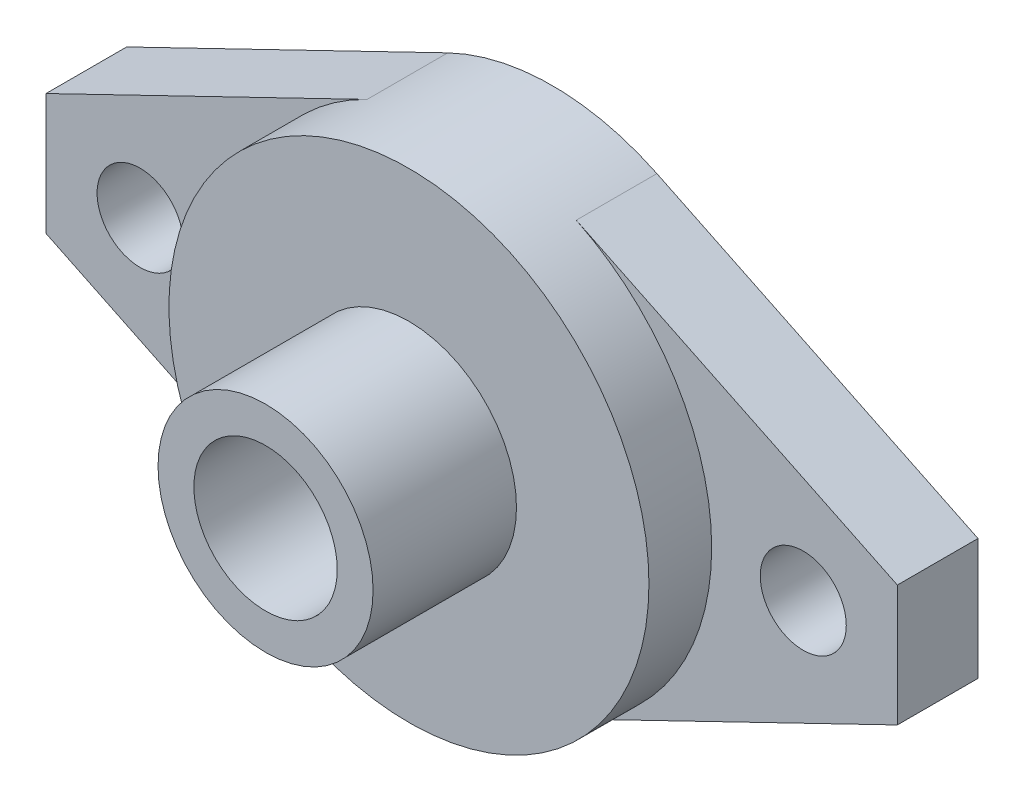
ISO-10303-21;
HEADER;
FILE_DESCRIPTION(('STEP AP214'),'2;1');
FILE_NAME('part.step','',(''),(''),'','','');
FILE_SCHEMA(('AUTOMOTIVE_DESIGN { 1 0 10303 214 1 1 1 1 }'));
ENDSEC;
DATA;
#1=APPLICATION_CONTEXT('core data for automotive mechanical design processes');
#2=APPLICATION_PROTOCOL_DEFINITION('international standard','automotive_design',2000,#1);
#3=PRODUCT_CONTEXT('',#1,'mechanical');
#4=PRODUCT('Part','Part','',(#3));
#5=PRODUCT_RELATED_PRODUCT_CATEGORY('part','',(#4));
#6=PRODUCT_DEFINITION_FORMATION('','',#4);
#7=PRODUCT_DEFINITION_CONTEXT('part definition',#1,'design');
#8=PRODUCT_DEFINITION('design','',#6,#7);
#9=PRODUCT_DEFINITION_SHAPE('','',#8);
#10=(LENGTH_UNIT() NAMED_UNIT(*) SI_UNIT(.MILLI.,.METRE.));
#11=(NAMED_UNIT(*) PLANE_ANGLE_UNIT() SI_UNIT($,.RADIAN.));
#12=(NAMED_UNIT(*) SI_UNIT($,.STERADIAN.) SOLID_ANGLE_UNIT());
#13=UNCERTAINTY_MEASURE_WITH_UNIT(LENGTH_MEASURE(1.E-05),#10,'distance_accuracy_value','');
#14=(GEOMETRIC_REPRESENTATION_CONTEXT(3) GLOBAL_UNCERTAINTY_ASSIGNED_CONTEXT((#13)) GLOBAL_UNIT_ASSIGNED_CONTEXT((#10,
#11,#12)) REPRESENTATION_CONTEXT('',''));
#15=CARTESIAN_POINT('',(0.,0.,0.));
#16=DIRECTION('',(0.,0.,1.));
#17=DIRECTION('',(1.,0.,0.));
#18=AXIS2_PLACEMENT_3D('',#15,#16,#17);
#19=CARTESIAN_POINT('',(0.,0.,16.));
#20=DIRECTION('',(0.,0.,-1.));
#21=DIRECTION('',(-1.,0.,0.));
#22=AXIS2_PLACEMENT_3D('',#19,#20,#21);
#23=CYLINDRICAL_SURFACE('',#22,4.);
#24=CARTESIAN_POINT('',(0.,0.,16.));
#25=DIRECTION('',(0.,0.,1.));
#26=DIRECTION('',(1.,0.,0.));
#27=AXIS2_PLACEMENT_3D('',#24,#25,#26);
#28=CIRCLE('',#27,4.);
#29=CARTESIAN_POINT('',(4.,0.,16.));
#30=VERTEX_POINT('',#29);
#31=EDGE_CURVE('E53',#30,#30,#28,.T.);
#32=ORIENTED_EDGE('',*,*,#31,.T.);
#33=EDGE_LOOP('',(#32));
#34=FACE_BOUND('',#33,.T.);
#35=CARTESIAN_POINT('',(0.,0.,0.));
#36=DIRECTION('',(0.,0.,1.));
#37=DIRECTION('',(1.,0.,0.));
#38=AXIS2_PLACEMENT_3D('',#35,#36,#37);
#39=CIRCLE('',#38,4.);
#40=CARTESIAN_POINT('',(4.,0.,0.));
#41=VERTEX_POINT('',#40);
#42=EDGE_CURVE('E59',#41,#41,#39,.T.);
#43=ORIENTED_EDGE('',*,*,#42,.F.);
#44=EDGE_LOOP('',(#43));
#45=FACE_BOUND('',#44,.T.);
#46=ADVANCED_FACE('F46',(#34,#45),#23,.F.);
#47=CARTESIAN_POINT('',(0.,0.,16.));
#48=DIRECTION('',(0.,0.,-1.));
#49=DIRECTION('',(-1.,0.,0.));
#50=AXIS2_PLACEMENT_3D('',#47,#48,#49);
#51=CYLINDRICAL_SURFACE('',#50,6.);
#52=CARTESIAN_POINT('',(0.,0.,16.));
#53=DIRECTION('',(0.,0.,1.));
#54=DIRECTION('',(1.,0.,0.));
#55=AXIS2_PLACEMENT_3D('',#52,#53,#54);
#56=CIRCLE('',#55,6.);
#57=CARTESIAN_POINT('',(6.,0.,16.));
#58=VERTEX_POINT('',#57);
#59=EDGE_CURVE('E11',#58,#58,#56,.T.);
#60=ORIENTED_EDGE('',*,*,#59,.F.);
#61=EDGE_LOOP('',(#60));
#62=FACE_BOUND('',#61,.T.);
#63=CARTESIAN_POINT('',(0.,0.,0.));
#64=DIRECTION('',(0.,0.,1.));
#65=DIRECTION('',(1.,0.,0.));
#66=AXIS2_PLACEMENT_3D('',#63,#64,#65);
#67=CIRCLE('',#66,6.);
#68=CARTESIAN_POINT('',(6.,0.,0.));
#69=VERTEX_POINT('',#68);
#70=EDGE_CURVE('E49',#69,#69,#67,.T.);
#71=ORIENTED_EDGE('',*,*,#70,.T.);
#72=EDGE_LOOP('',(#71));
#73=FACE_BOUND('',#72,.T.);
#74=ADVANCED_FACE('F66',(#62,#73),#51,.T.);
#75=CARTESIAN_POINT('',(0.,0.,16.));
#76=DIRECTION('',(0.,0.,1.));
#77=DIRECTION('',(1.,0.,0.));
#78=AXIS2_PLACEMENT_3D('',#75,#76,#77);
#79=PLANE('',#78);
#80=ORIENTED_EDGE('',*,*,#31,.F.);
#81=EDGE_LOOP('',(#80));
#82=FACE_BOUND('',#81,.T.);
#83=ORIENTED_EDGE('',*,*,#59,.T.);
#84=EDGE_LOOP('',(#83));
#85=FACE_BOUND('',#84,.T.);
#86=ADVANCED_FACE('F70',(#82,#85),#79,.T.);
#87=CARTESIAN_POINT('',(0.,0.,0.));
#88=DIRECTION('',(0.,0.,1.));
#89=DIRECTION('',(1.,0.,0.));
#90=AXIS2_PLACEMENT_3D('',#87,#88,#89);
#91=PLANE('',#90);
#92=ORIENTED_EDGE('',*,*,#42,.T.);
#93=EDGE_LOOP('',(#92));
#94=FACE_BOUND('',#93,.T.);
#95=ORIENTED_EDGE('',*,*,#70,.F.);
#96=EDGE_LOOP('',(#95));
#97=FACE_BOUND('',#96,.T.);
#98=ADVANCED_FACE('F68',(#94,#97),#91,.F.);
#99=CLOSED_SHELL('',(#46,#74,#86,#98));
#100=MANIFOLD_SOLID_BREP('B2',#99);
#101=CARTESIAN_POINT('',(0.,0.,8.));
#102=DIRECTION('',(0.,0.,-1.));
#103=DIRECTION('',(-1.,0.,0.));
#104=AXIS2_PLACEMENT_3D('',#101,#102,#103);
#105=CYLINDRICAL_SURFACE('',#104,13.3910717733651);
#106=CARTESIAN_POINT('',(0.,0.,8.));
#107=DIRECTION('',(0.,0.,1.));
#108=DIRECTION('',(1.,0.,0.));
#109=AXIS2_PLACEMENT_3D('',#106,#107,#108);
#110=CIRCLE('',#109,13.3910717733651);
#111=CARTESIAN_POINT('',(13.3910717733651,0.,8.));
#112=VERTEX_POINT('',#111);
#113=EDGE_CURVE('E212',#112,#112,#110,.T.);
#114=ORIENTED_EDGE('',*,*,#113,.F.);
#115=EDGE_LOOP('',(#114));
#116=FACE_BOUND('',#115,.T.);
#117=DIRECTION('',(0.,0.,-1.));
#118=VECTOR('',#117,1.);
#119=CARTESIAN_POINT('',(5.83466280405099,-12.0531121791196,4.5));
#120=LINE('',#119,#118);
#121=CARTESIAN_POINT('',(5.83466280405099,-12.0531121791196,4.5));
#122=VERTEX_POINT('',#121);
#123=CARTESIAN_POINT('',(5.83466280405099,-12.0531121791196,0.));
#124=VERTEX_POINT('',#123);
#125=EDGE_CURVE('E127',#122,#124,#120,.T.);
#126=ORIENTED_EDGE('',*,*,#125,.F.);
#127=CARTESIAN_POINT('',(0.,0.,4.5));
#128=DIRECTION('',(0.,0.,1.));
#129=DIRECTION('',(1.,0.,0.));
#130=AXIS2_PLACEMENT_3D('',#127,#128,#129);
#131=CIRCLE('',#130,13.3910717733651);
#132=CARTESIAN_POINT('',(5.83466280405099,12.0531121791196,4.5));
#133=VERTEX_POINT('',#132);
#134=EDGE_CURVE('E122',#122,#133,#131,.T.);
#135=ORIENTED_EDGE('',*,*,#134,.T.);
#136=DIRECTION('',(0.,0.,-1.));
#137=VECTOR('',#136,1.);
#138=CARTESIAN_POINT('',(5.83466280405099,12.0531121791196,4.5));
#139=LINE('',#138,#137);
#140=CARTESIAN_POINT('',(5.83466280405099,12.0531121791196,0.));
#141=VERTEX_POINT('',#140);
#142=EDGE_CURVE('E198',#133,#141,#139,.T.);
#143=ORIENTED_EDGE('',*,*,#142,.T.);
#144=CARTESIAN_POINT('',(0.,0.,0.));
#145=DIRECTION('',(0.,0.,1.));
#146=DIRECTION('',(1.,0.,0.));
#147=AXIS2_PLACEMENT_3D('',#144,#145,#146);
#148=CIRCLE('',#147,13.3910717733651);
#149=CARTESIAN_POINT('',(-5.83466280405099,12.0531121791196,0.));
#150=VERTEX_POINT('',#149);
#151=EDGE_CURVE('E211',#141,#150,#148,.T.);
#152=ORIENTED_EDGE('',*,*,#151,.T.);
#153=DIRECTION('',(0.,0.,-1.));
#154=VECTOR('',#153,1.);
#155=CARTESIAN_POINT('',(-5.83466280405099,12.0531121791196,4.5));
#156=LINE('',#155,#154);
#157=CARTESIAN_POINT('',(-5.83466280405099,12.0531121791196,4.5));
#158=VERTEX_POINT('',#157);
#159=EDGE_CURVE('E44',#158,#150,#156,.T.);
#160=ORIENTED_EDGE('',*,*,#159,.F.);
#161=CARTESIAN_POINT('',(0.,0.,4.5));
#162=DIRECTION('',(0.,0.,1.));
#163=DIRECTION('',(1.,0.,0.));
#164=AXIS2_PLACEMENT_3D('',#161,#162,#163);
#165=CIRCLE('',#164,13.3910717733651);
#166=CARTESIAN_POINT('',(-5.83466280405099,-12.0531121791196,4.5));
#167=VERTEX_POINT('',#166);
#168=EDGE_CURVE('E224',#158,#167,#165,.T.);
#169=ORIENTED_EDGE('',*,*,#168,.T.);
#170=DIRECTION('',(0.,0.,-1.));
#171=VECTOR('',#170,1.);
#172=CARTESIAN_POINT('',(-5.83466280405099,-12.0531121791196,4.5));
#173=LINE('',#172,#171);
#174=CARTESIAN_POINT('',(-5.83466280405099,-12.0531121791196,0.));
#175=VERTEX_POINT('',#174);
#176=EDGE_CURVE('E239',#167,#175,#173,.T.);
#177=ORIENTED_EDGE('',*,*,#176,.T.);
#178=EDGE_CURVE('E220',#175,#124,#148,.T.);
#179=ORIENTED_EDGE('',*,*,#178,.T.);
#180=EDGE_LOOP('',(#126,#135,#143,#152,#160,#169,#177,#179));
#181=FACE_BOUND('',#180,.T.);
#182=ADVANCED_FACE('F107',(#116,#181),#105,.T.);
#183=CARTESIAN_POINT('',(-5.83466280405099,12.0531121791196,4.5));
#184=DIRECTION('',(-0.435712906539426,0.900085697628268,0.));
#185=DIRECTION('',(-0.900085697628268,-0.435712906539426,0.));
#186=AXIS2_PLACEMENT_3D('',#183,#184,#185);
#187=PLANE('',#186);
#188=DIRECTION('',(0.900085697628268,0.435712906539426,0.));
#189=VECTOR('',#188,1.);
#190=CARTESIAN_POINT('',(-5.83466280405099,12.0531121791196,0.));
#191=LINE('',#190,#189);
#192=CARTESIAN_POINT('',(-23.75,3.38066725320913,0.));
#193=VERTEX_POINT('',#192);
#194=EDGE_CURVE('E219',#193,#150,#191,.T.);
#195=ORIENTED_EDGE('',*,*,#194,.F.);
#196=DIRECTION('',(0.,0.,-1.));
#197=VECTOR('',#196,1.);
#198=CARTESIAN_POINT('',(-23.75,3.38066725320913,4.5));
#199=LINE('',#198,#197);
#200=CARTESIAN_POINT('',(-23.75,3.38066725320913,4.5));
#201=VERTEX_POINT('',#200);
#202=EDGE_CURVE('E115',#201,#193,#199,.T.);
#203=ORIENTED_EDGE('',*,*,#202,.F.);
#204=DIRECTION('',(0.900085697628268,0.435712906539426,0.));
#205=VECTOR('',#204,1.);
#206=CARTESIAN_POINT('',(-5.83466280405099,12.0531121791196,4.5));
#207=LINE('',#206,#205);
#208=EDGE_CURVE('E226',#201,#158,#207,.T.);
#209=ORIENTED_EDGE('',*,*,#208,.T.);
#210=ORIENTED_EDGE('',*,*,#159,.T.);
#211=EDGE_LOOP('',(#195,#203,#209,#210));
#212=FACE_BOUND('',#211,.T.);
#213=ADVANCED_FACE('F109',(#212),#187,.T.);
#214=CARTESIAN_POINT('',(-23.75,0.,4.5));
#215=DIRECTION('',(-1.,0.,0.));
#216=DIRECTION('',(0.,0.,1.));
#217=AXIS2_PLACEMENT_3D('',#214,#215,#216);
#218=PLANE('',#217);
#219=DIRECTION('',(0.,1.,0.));
#220=VECTOR('',#219,1.);
#221=CARTESIAN_POINT('',(-23.75,0.,0.));
#222=LINE('',#221,#220);
#223=CARTESIAN_POINT('',(-23.75,-3.38066725320913,0.));
#224=VERTEX_POINT('',#223);
#225=EDGE_CURVE('E242',#224,#193,#222,.T.);
#226=ORIENTED_EDGE('',*,*,#225,.F.);
#227=DIRECTION('',(0.,0.,-1.));
#228=VECTOR('',#227,1.);
#229=CARTESIAN_POINT('',(-23.75,-3.38066725320913,4.5));
#230=LINE('',#229,#228);
#231=CARTESIAN_POINT('',(-23.75,-3.38066725320913,4.5));
#232=VERTEX_POINT('',#231);
#233=EDGE_CURVE('E252',#232,#224,#230,.T.);
#234=ORIENTED_EDGE('',*,*,#233,.F.);
#235=DIRECTION('',(0.,1.,0.));
#236=VECTOR('',#235,1.);
#237=CARTESIAN_POINT('',(-23.75,0.,4.5));
#238=LINE('',#237,#236);
#239=EDGE_CURVE('E230',#232,#201,#238,.T.);
#240=ORIENTED_EDGE('',*,*,#239,.T.);
#241=ORIENTED_EDGE('',*,*,#202,.T.);
#242=EDGE_LOOP('',(#226,#234,#240,#241));
#243=FACE_BOUND('',#242,.T.);
#244=ADVANCED_FACE('F256',(#243),#218,.T.);
#245=CARTESIAN_POINT('',(-5.83466280405099,-12.0531121791196,4.5));
#246=DIRECTION('',(0.435712906539426,0.900085697628268,0.));
#247=DIRECTION('',(-0.900085697628268,0.435712906539426,0.));
#248=AXIS2_PLACEMENT_3D('',#245,#246,#247);
#249=PLANE('',#248);
#250=DIRECTION('',(0.900085697628268,-0.435712906539426,0.));
#251=VECTOR('',#250,1.);
#252=CARTESIAN_POINT('',(-5.83466280405099,-12.0531121791196,0.));
#253=LINE('',#252,#251);
#254=EDGE_CURVE('E245',#224,#175,#253,.T.);
#255=ORIENTED_EDGE('',*,*,#254,.T.);
#256=ORIENTED_EDGE('',*,*,#176,.F.);
#257=DIRECTION('',(0.900085697628268,-0.435712906539426,0.));
#258=VECTOR('',#257,1.);
#259=CARTESIAN_POINT('',(-5.83466280405099,-12.0531121791196,4.5));
#260=LINE('',#259,#258);
#261=EDGE_CURVE('E233',#232,#167,#260,.T.);
#262=ORIENTED_EDGE('',*,*,#261,.F.);
#263=ORIENTED_EDGE('',*,*,#233,.T.);
#264=EDGE_LOOP('',(#255,#256,#262,#263));
#265=FACE_BOUND('',#264,.T.);
#266=ADVANCED_FACE('F266',(#265),#249,.F.);
#267=CARTESIAN_POINT('',(-18.5,0.,4.5));
#268=DIRECTION('',(0.,0.,-1.));
#269=DIRECTION('',(-1.,0.,0.));
#270=AXIS2_PLACEMENT_3D('',#267,#268,#269);
#271=CYLINDRICAL_SURFACE('',#270,2.4);
#272=CARTESIAN_POINT('',(-18.5,0.,4.5));
#273=DIRECTION('',(0.,0.,1.));
#274=DIRECTION('',(1.,0.,0.));
#275=AXIS2_PLACEMENT_3D('',#272,#273,#274);
#276=CIRCLE('',#275,2.4);
#277=CARTESIAN_POINT('',(-16.1,0.,4.5));
#278=VERTEX_POINT('',#277);
#279=EDGE_CURVE('E236',#278,#278,#276,.F.);
#280=ORIENTED_EDGE('',*,*,#279,.F.);
#281=EDGE_LOOP('',(#280));
#282=FACE_BOUND('',#281,.T.);
#283=CARTESIAN_POINT('',(-18.5,0.,0.));
#284=DIRECTION('',(0.,0.,1.));
#285=DIRECTION('',(1.,0.,0.));
#286=AXIS2_PLACEMENT_3D('',#283,#284,#285);
#287=CIRCLE('',#286,2.4);
#288=CARTESIAN_POINT('',(-16.1,0.,0.));
#289=VERTEX_POINT('',#288);
#290=EDGE_CURVE('E227',#289,#289,#287,.F.);
#291=ORIENTED_EDGE('',*,*,#290,.T.);
#292=EDGE_LOOP('',(#291));
#293=FACE_BOUND('',#292,.T.);
#294=ADVANCED_FACE('F300',(#282,#293),#271,.F.);
#295=CARTESIAN_POINT('',(0.,0.,4.5));
#296=DIRECTION('',(0.,0.,1.));
#297=DIRECTION('',(1.,0.,0.));
#298=AXIS2_PLACEMENT_3D('',#295,#296,#297);
#299=PLANE('',#298);
#300=ORIENTED_EDGE('',*,*,#168,.F.);
#301=ORIENTED_EDGE('',*,*,#208,.F.);
#302=ORIENTED_EDGE('',*,*,#239,.F.);
#303=ORIENTED_EDGE('',*,*,#261,.T.);
#304=EDGE_LOOP('',(#300,#301,#302,#303));
#305=FACE_BOUND('',#304,.T.);
#306=ORIENTED_EDGE('',*,*,#279,.T.);
#307=EDGE_LOOP('',(#306));
#308=FACE_BOUND('',#307,.T.);
#309=ADVANCED_FACE('F270',(#305,#308),#299,.T.);
#310=CARTESIAN_POINT('',(0.,0.,0.));
#311=DIRECTION('',(0.,0.,1.));
#312=DIRECTION('',(1.,0.,0.));
#313=AXIS2_PLACEMENT_3D('',#310,#311,#312);
#314=PLANE('',#313);
#315=ORIENTED_EDGE('',*,*,#194,.T.);
#316=ORIENTED_EDGE('',*,*,#151,.F.);
#317=DIRECTION('',(-0.900085697628268,0.435712906539426,0.));
#318=VECTOR('',#317,1.);
#319=CARTESIAN_POINT('',(5.83466280405099,12.0531121791196,0.));
#320=LINE('',#319,#318);
#321=CARTESIAN_POINT('',(23.75,3.38066725320913,0.));
#322=VERTEX_POINT('',#321);
#323=EDGE_CURVE('E205',#322,#141,#320,.T.);
#324=ORIENTED_EDGE('',*,*,#323,.F.);
#325=DIRECTION('',(0.,1.,0.));
#326=VECTOR('',#325,1.);
#327=CARTESIAN_POINT('',(23.75,0.,0.));
#328=LINE('',#327,#326);
#329=CARTESIAN_POINT('',(23.75,-3.38066725320913,0.));
#330=VERTEX_POINT('',#329);
#331=EDGE_CURVE('E203',#330,#322,#328,.T.);
#332=ORIENTED_EDGE('',*,*,#331,.F.);
#333=DIRECTION('',(-0.900085697628268,-0.435712906539426,0.));
#334=VECTOR('',#333,1.);
#335=CARTESIAN_POINT('',(5.83466280405099,-12.0531121791196,0.));
#336=LINE('',#335,#334);
#337=EDGE_CURVE('E177',#330,#124,#336,.T.);
#338=ORIENTED_EDGE('',*,*,#337,.T.);
#339=ORIENTED_EDGE('',*,*,#178,.F.);
#340=ORIENTED_EDGE('',*,*,#254,.F.);
#341=ORIENTED_EDGE('',*,*,#225,.T.);
#342=EDGE_LOOP('',(#315,#316,#324,#332,#338,#339,#340,#341));
#343=FACE_BOUND('',#342,.T.);
#344=ORIENTED_EDGE('',*,*,#290,.F.);
#345=EDGE_LOOP('',(#344));
#346=FACE_BOUND('',#345,.T.);
#347=CARTESIAN_POINT('',(0.,0.,0.));
#348=DIRECTION('',(0.,0.,1.));
#349=DIRECTION('',(1.,0.,0.));
#350=AXIS2_PLACEMENT_3D('',#347,#348,#349);
#351=CIRCLE('',#350,6.);
#352=CARTESIAN_POINT('',(6.,0.,0.));
#353=VERTEX_POINT('',#352);
#354=EDGE_CURVE('E216',#353,#353,#351,.T.);
#355=ORIENTED_EDGE('',*,*,#354,.T.);
#356=EDGE_LOOP('',(#355));
#357=FACE_BOUND('',#356,.T.);
#358=CARTESIAN_POINT('',(18.5,0.,0.));
#359=DIRECTION('',(0.,0.,1.));
#360=DIRECTION('',(1.,0.,0.));
#361=AXIS2_PLACEMENT_3D('',#358,#359,#360);
#362=CIRCLE('',#361,2.4);
#363=CARTESIAN_POINT('',(20.9,0.,0.));
#364=VERTEX_POINT('',#363);
#365=EDGE_CURVE('E199',#364,#364,#362,.T.);
#366=ORIENTED_EDGE('',*,*,#365,.T.);
#367=EDGE_LOOP('',(#366));
#368=FACE_BOUND('',#367,.T.);
#369=ADVANCED_FACE('F262',(#343,#346,#357,#368),#314,.F.);
#370=CARTESIAN_POINT('',(0.,0.,8.));
#371=DIRECTION('',(0.,0.,-1.));
#372=DIRECTION('',(-1.,0.,0.));
#373=AXIS2_PLACEMENT_3D('',#370,#371,#372);
#374=CYLINDRICAL_SURFACE('',#373,6.);
#375=CARTESIAN_POINT('',(0.,0.,8.));
#376=DIRECTION('',(0.,0.,1.));
#377=DIRECTION('',(1.,0.,0.));
#378=AXIS2_PLACEMENT_3D('',#375,#376,#377);
#379=CIRCLE('',#378,6.);
#380=CARTESIAN_POINT('',(6.,0.,8.));
#381=VERTEX_POINT('',#380);
#382=EDGE_CURVE('E215',#381,#381,#379,.T.);
#383=ORIENTED_EDGE('',*,*,#382,.T.);
#384=EDGE_LOOP('',(#383));
#385=FACE_BOUND('',#384,.T.);
#386=ORIENTED_EDGE('',*,*,#354,.F.);
#387=EDGE_LOOP('',(#386));
#388=FACE_BOUND('',#387,.T.);
#389=ADVANCED_FACE('F296',(#385,#388),#374,.F.);
#390=CARTESIAN_POINT('',(0.,0.,8.));
#391=DIRECTION('',(0.,0.,1.));
#392=DIRECTION('',(1.,0.,0.));
#393=AXIS2_PLACEMENT_3D('',#390,#391,#392);
#394=PLANE('',#393);
#395=ORIENTED_EDGE('',*,*,#113,.T.);
#396=EDGE_LOOP('',(#395));
#397=FACE_BOUND('',#396,.T.);
#398=ORIENTED_EDGE('',*,*,#382,.F.);
#399=EDGE_LOOP('',(#398));
#400=FACE_BOUND('',#399,.T.);
#401=ADVANCED_FACE('F334',(#397,#400),#394,.T.);
#402=CARTESIAN_POINT('',(5.83466280405099,-12.0531121791196,4.5));
#403=DIRECTION('',(0.435712906539426,-0.900085697628268,0.));
#404=DIRECTION('',(0.900085697628268,0.435712906539426,0.));
#405=AXIS2_PLACEMENT_3D('',#402,#403,#404);
#406=PLANE('',#405);
#407=ORIENTED_EDGE('',*,*,#337,.F.);
#408=DIRECTION('',(0.,0.,-1.));
#409=VECTOR('',#408,1.);
#410=CARTESIAN_POINT('',(23.75,-3.38066725320913,4.5));
#411=LINE('',#410,#409);
#412=CARTESIAN_POINT('',(23.75,-3.38066725320913,4.5));
#413=VERTEX_POINT('',#412);
#414=EDGE_CURVE('E171',#413,#330,#411,.T.);
#415=ORIENTED_EDGE('',*,*,#414,.F.);
#416=DIRECTION('',(-0.900085697628268,-0.435712906539426,0.));
#417=VECTOR('',#416,1.);
#418=CARTESIAN_POINT('',(5.83466280405099,-12.0531121791196,4.5));
#419=LINE('',#418,#417);
#420=EDGE_CURVE('E175',#413,#122,#419,.T.);
#421=ORIENTED_EDGE('',*,*,#420,.T.);
#422=ORIENTED_EDGE('',*,*,#125,.T.);
#423=EDGE_LOOP('',(#407,#415,#421,#422));
#424=FACE_BOUND('',#423,.T.);
#425=ADVANCED_FACE('F173',(#424),#406,.T.);
#426=CARTESIAN_POINT('',(23.75,0.,4.5));
#427=DIRECTION('',(-1.,0.,0.));
#428=DIRECTION('',(0.,0.,1.));
#429=AXIS2_PLACEMENT_3D('',#426,#427,#428);
#430=PLANE('',#429);
#431=ORIENTED_EDGE('',*,*,#331,.T.);
#432=DIRECTION('',(0.,0.,-1.));
#433=VECTOR('',#432,1.);
#434=CARTESIAN_POINT('',(23.75,3.38066725320913,4.5));
#435=LINE('',#434,#433);
#436=CARTESIAN_POINT('',(23.75,3.38066725320913,4.5));
#437=VERTEX_POINT('',#436);
#438=EDGE_CURVE('E181',#437,#322,#435,.T.);
#439=ORIENTED_EDGE('',*,*,#438,.F.);
#440=DIRECTION('',(0.,1.,0.));
#441=VECTOR('',#440,1.);
#442=CARTESIAN_POINT('',(23.75,0.,4.5));
#443=LINE('',#442,#441);
#444=EDGE_CURVE('E185',#413,#437,#443,.T.);
#445=ORIENTED_EDGE('',*,*,#444,.F.);
#446=ORIENTED_EDGE('',*,*,#414,.T.);
#447=EDGE_LOOP('',(#431,#439,#445,#446));
#448=FACE_BOUND('',#447,.T.);
#449=ADVANCED_FACE('F186',(#448),#430,.F.);
#450=CARTESIAN_POINT('',(18.5,0.,4.5));
#451=DIRECTION('',(0.,0.,-1.));
#452=DIRECTION('',(-1.,0.,0.));
#453=AXIS2_PLACEMENT_3D('',#450,#451,#452);
#454=CYLINDRICAL_SURFACE('',#453,2.4);
#455=CARTESIAN_POINT('',(18.5,0.,4.5));
#456=DIRECTION('',(0.,0.,1.));
#457=DIRECTION('',(1.,0.,0.));
#458=AXIS2_PLACEMENT_3D('',#455,#456,#457);
#459=CIRCLE('',#458,2.4);
#460=CARTESIAN_POINT('',(20.9,0.,4.5));
#461=VERTEX_POINT('',#460);
#462=EDGE_CURVE('E193',#461,#461,#459,.T.);
#463=ORIENTED_EDGE('',*,*,#462,.T.);
#464=EDGE_LOOP('',(#463));
#465=FACE_BOUND('',#464,.T.);
#466=ORIENTED_EDGE('',*,*,#365,.F.);
#467=EDGE_LOOP('',(#466));
#468=FACE_BOUND('',#467,.T.);
#469=ADVANCED_FACE('F276',(#465,#468),#454,.F.);
#470=CARTESIAN_POINT('',(5.83466280405099,12.0531121791196,4.5));
#471=DIRECTION('',(-0.435712906539426,-0.900085697628268,0.));
#472=DIRECTION('',(0.900085697628268,-0.435712906539426,0.));
#473=AXIS2_PLACEMENT_3D('',#470,#471,#472);
#474=PLANE('',#473);
#475=ORIENTED_EDGE('',*,*,#323,.T.);
#476=ORIENTED_EDGE('',*,*,#142,.F.);
#477=DIRECTION('',(-0.900085697628268,0.435712906539426,0.));
#478=VECTOR('',#477,1.);
#479=CARTESIAN_POINT('',(5.83466280405099,12.0531121791196,4.5));
#480=LINE('',#479,#478);
#481=EDGE_CURVE('E189',#437,#133,#480,.T.);
#482=ORIENTED_EDGE('',*,*,#481,.F.);
#483=ORIENTED_EDGE('',*,*,#438,.T.);
#484=EDGE_LOOP('',(#475,#476,#482,#483));
#485=FACE_BOUND('',#484,.T.);
#486=ADVANCED_FACE('F274',(#485),#474,.F.);
#487=CARTESIAN_POINT('',(0.,0.,4.5));
#488=DIRECTION('',(0.,0.,1.));
#489=DIRECTION('',(1.,0.,0.));
#490=AXIS2_PLACEMENT_3D('',#487,#488,#489);
#491=PLANE('',#490);
#492=ORIENTED_EDGE('',*,*,#462,.F.);
#493=EDGE_LOOP('',(#492));
#494=FACE_BOUND('',#493,.T.);
#495=ORIENTED_EDGE('',*,*,#134,.F.);
#496=ORIENTED_EDGE('',*,*,#420,.F.);
#497=ORIENTED_EDGE('',*,*,#444,.T.);
#498=ORIENTED_EDGE('',*,*,#481,.T.);
#499=EDGE_LOOP('',(#495,#496,#497,#498));
#500=FACE_BOUND('',#499,.T.);
#501=ADVANCED_FACE('F191',(#494,#500),#491,.T.);
#502=CLOSED_SHELL('',(#182,#213,#244,#266,#294,#309,#369,#389,#401,#425,#449,#469,#486,#501));
#503=MANIFOLD_SOLID_BREP('B6',#502);
#504=ADVANCED_BREP_SHAPE_REPRESENTATION('',(#18,#100,#503),#14);
#505=SHAPE_DEFINITION_REPRESENTATION(#9,#504);
ENDSEC;
END-ISO-10303-21;
